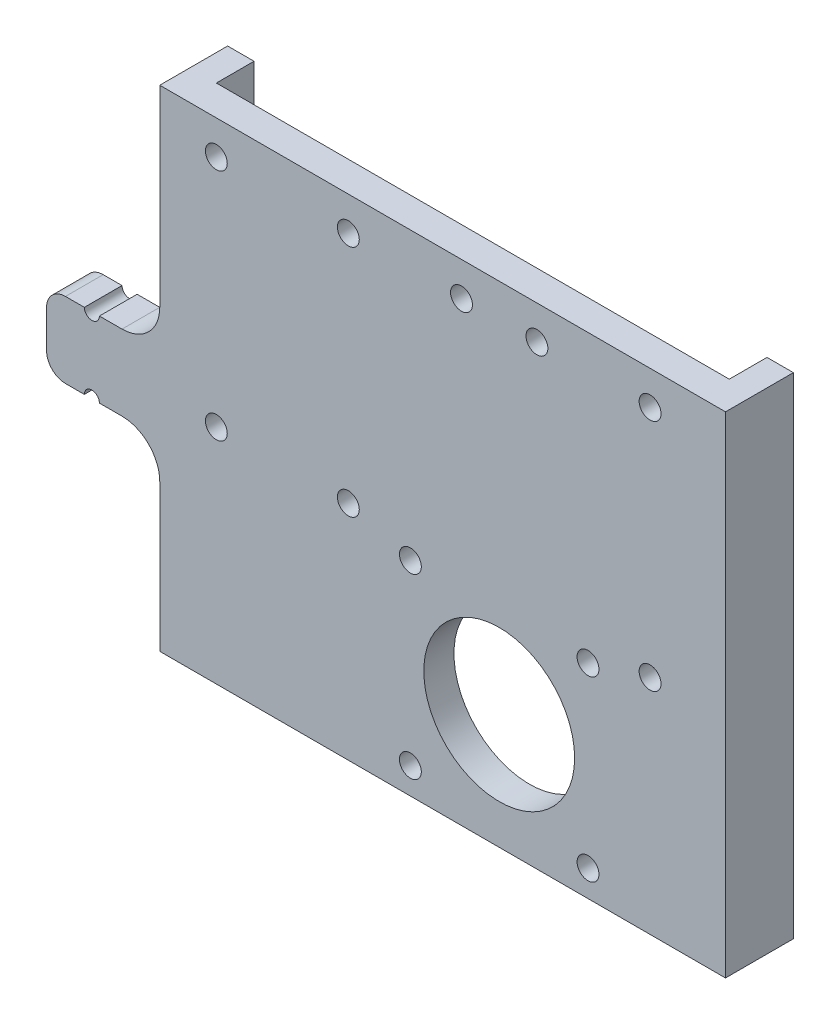
ISO-10303-21;
HEADER;
FILE_DESCRIPTION(('STEP AP214'),'2;1');
FILE_NAME('part.step','',(''),(''),'','','');
FILE_SCHEMA(('AUTOMOTIVE_DESIGN { 1 0 10303 214 1 1 1 1 }'));
ENDSEC;
DATA;
#1=APPLICATION_CONTEXT('core data for automotive mechanical design processes');
#2=APPLICATION_PROTOCOL_DEFINITION('international standard','automotive_design',2000,#1);
#3=PRODUCT_CONTEXT('',#1,'mechanical');
#4=PRODUCT('Part','Part','',(#3));
#5=PRODUCT_RELATED_PRODUCT_CATEGORY('part','',(#4));
#6=PRODUCT_DEFINITION_FORMATION('','',#4);
#7=PRODUCT_DEFINITION_CONTEXT('part definition',#1,'design');
#8=PRODUCT_DEFINITION('design','',#6,#7);
#9=PRODUCT_DEFINITION_SHAPE('','',#8);
#10=(LENGTH_UNIT() NAMED_UNIT(*) SI_UNIT(.MILLI.,.METRE.));
#11=(NAMED_UNIT(*) PLANE_ANGLE_UNIT() SI_UNIT($,.RADIAN.));
#12=(NAMED_UNIT(*) SI_UNIT($,.STERADIAN.) SOLID_ANGLE_UNIT());
#13=UNCERTAINTY_MEASURE_WITH_UNIT(LENGTH_MEASURE(1.E-05),#10,'distance_accuracy_value','');
#14=(GEOMETRIC_REPRESENTATION_CONTEXT(3) GLOBAL_UNCERTAINTY_ASSIGNED_CONTEXT((#13)) GLOBAL_UNIT_ASSIGNED_CONTEXT((#10,
#11,#12)) REPRESENTATION_CONTEXT('',''));
#15=CARTESIAN_POINT('',(0.,0.,0.));
#16=DIRECTION('',(0.,0.,1.));
#17=DIRECTION('',(1.,0.,0.));
#18=AXIS2_PLACEMENT_3D('',#15,#16,#17);
#19=CARTESIAN_POINT('',(-90.,4.00000000000002,-2.));
#20=DIRECTION('',(0.,1.,0.));
#21=DIRECTION('',(0.,0.,-1.));
#22=AXIS2_PLACEMENT_3D('',#19,#20,#21);
#23=PLANE('',#22);
#24=DIRECTION('',(0.,0.,-1.));
#25=VECTOR('',#24,1.);
#26=CARTESIAN_POINT('',(-110.,4.00000000000002,8.001));
#27=LINE('',#26,#25);
#28=CARTESIAN_POINT('',(-110.,4.00000000000002,8.));
#29=VERTEX_POINT('',#28);
#30=CARTESIAN_POINT('',(-110.,4.00000000000002,-2.));
#31=VERTEX_POINT('',#30);
#32=EDGE_CURVE('E216',#29,#31,#27,.T.);
#33=ORIENTED_EDGE('',*,*,#32,.T.);
#34=DIRECTION('',(1.,0.,0.));
#35=VECTOR('',#34,1.);
#36=CARTESIAN_POINT('',(-90.,4.00000000000002,-2.));
#37=LINE('',#36,#35);
#38=CARTESIAN_POINT('',(-115.,4.00000000000002,-2.));
#39=VERTEX_POINT('',#38);
#40=EDGE_CURVE('E230',#39,#31,#37,.T.);
#41=ORIENTED_EDGE('',*,*,#40,.F.);
#42=DIRECTION('',(0.,0.,1.));
#43=VECTOR('',#42,1.);
#44=CARTESIAN_POINT('',(-115.,4.00000000000002,-2.));
#45=LINE('',#44,#43);
#46=CARTESIAN_POINT('',(-115.,4.00000000000002,8.));
#47=VERTEX_POINT('',#46);
#48=EDGE_CURVE('E11',#47,#39,#45,.F.);
#49=ORIENTED_EDGE('',*,*,#48,.F.);
#50=DIRECTION('',(1.,0.,0.));
#51=VECTOR('',#50,1.);
#52=CARTESIAN_POINT('',(-90.,4.00000000000002,8.));
#53=LINE('',#52,#51);
#54=EDGE_CURVE('E223',#47,#29,#53,.T.);
#55=ORIENTED_EDGE('',*,*,#54,.T.);
#56=EDGE_LOOP('',(#33,#41,#49,#55));
#57=FACE_BOUND('',#56,.T.);
#58=ADVANCED_FACE('F44',(#57),#23,.T.);
#59=CARTESIAN_POINT('',(-90.,-16.,-2.));
#60=DIRECTION('',(0.,-1.,0.));
#61=DIRECTION('',(0.,0.,1.));
#62=AXIS2_PLACEMENT_3D('',#59,#60,#61);
#63=PLANE('',#62);
#64=DIRECTION('',(0.,0.,-1.));
#65=VECTOR('',#64,1.);
#66=CARTESIAN_POINT('',(-106.,-16.,8.001));
#67=LINE('',#66,#65);
#68=CARTESIAN_POINT('',(-106.,-16.,8.));
#69=VERTEX_POINT('',#68);
#70=CARTESIAN_POINT('',(-106.,-16.,-2.));
#71=VERTEX_POINT('',#70);
#72=EDGE_CURVE('E192',#69,#71,#67,.T.);
#73=ORIENTED_EDGE('',*,*,#72,.T.);
#74=DIRECTION('',(-1.,0.,0.));
#75=VECTOR('',#74,1.);
#76=CARTESIAN_POINT('',(-90.,-16.,-2.));
#77=LINE('',#76,#75);
#78=CARTESIAN_POINT('',(-100.,-16.,-2.));
#79=VERTEX_POINT('',#78);
#80=EDGE_CURVE('E224',#79,#71,#77,.T.);
#81=ORIENTED_EDGE('',*,*,#80,.F.);
#82=DIRECTION('',(0.,0.,1.));
#83=VECTOR('',#82,1.);
#84=CARTESIAN_POINT('',(-100.,-16.,-2.));
#85=LINE('',#84,#83);
#86=CARTESIAN_POINT('',(-100.,-16.,8.));
#87=VERTEX_POINT('',#86);
#88=EDGE_CURVE('E387',#87,#79,#85,.F.);
#89=ORIENTED_EDGE('',*,*,#88,.F.);
#90=DIRECTION('',(-1.,0.,0.));
#91=VECTOR('',#90,1.);
#92=CARTESIAN_POINT('',(-90.,-16.,8.));
#93=LINE('',#92,#91);
#94=EDGE_CURVE('E203',#87,#69,#93,.T.);
#95=ORIENTED_EDGE('',*,*,#94,.T.);
#96=EDGE_LOOP('',(#73,#81,#89,#95));
#97=FACE_BOUND('',#96,.T.);
#98=ADVANCED_FACE('F418',(#97),#63,.T.);
#99=CARTESIAN_POINT('',(0.,0.,0.));
#100=DIRECTION('',(0.,0.,1.));
#101=DIRECTION('',(1.,0.,0.));
#102=AXIS2_PLACEMENT_3D('',#99,#100,#101);
#103=PLANE('',#102);
#104=CARTESIAN_POINT('',(-75.,-5.99999999999998,0.));
#105=DIRECTION('',(0.,0.,-1.));
#106=DIRECTION('',(1.,0.,0.));
#107=AXIS2_PLACEMENT_3D('',#104,#105,#106);
#108=CIRCLE('',#107,2.9);
#109=CARTESIAN_POINT('',(-72.1,-5.99999999999998,0.));
#110=VERTEX_POINT('',#109);
#111=EDGE_CURVE('E275',#110,#110,#108,.T.);
#112=ORIENTED_EDGE('',*,*,#111,.F.);
#113=EDGE_LOOP('',(#112));
#114=FACE_BOUND('',#113,.T.);
#115=CARTESIAN_POINT('',(-75.,56.,0.));
#116=DIRECTION('',(0.,0.,-1.));
#117=DIRECTION('',(1.,0.,0.));
#118=AXIS2_PLACEMENT_3D('',#115,#116,#117);
#119=CIRCLE('',#118,2.9);
#120=CARTESIAN_POINT('',(-72.1,56.,0.));
#121=VERTEX_POINT('',#120);
#122=EDGE_CURVE('E281',#121,#121,#119,.T.);
#123=ORIENTED_EDGE('',*,*,#122,.F.);
#124=EDGE_LOOP('',(#123));
#125=FACE_BOUND('',#124,.T.);
#126=CARTESIAN_POINT('',(0.,-34.5,0.));
#127=DIRECTION('',(0.,0.,-1.));
#128=DIRECTION('',(1.,0.,0.));
#129=AXIS2_PLACEMENT_3D('',#126,#127,#128);
#130=CIRCLE('',#129,20.);
#131=CARTESIAN_POINT('',(20.,-34.5,0.));
#132=VERTEX_POINT('',#131);
#133=EDGE_CURVE('E305',#132,#132,#130,.T.);
#134=ORIENTED_EDGE('',*,*,#133,.F.);
#135=EDGE_LOOP('',(#134));
#136=FACE_BOUND('',#135,.T.);
#137=CARTESIAN_POINT('',(-40.,-5.99999999999998,0.));
#138=DIRECTION('',(0.,0.,-1.));
#139=DIRECTION('',(1.,0.,0.));
#140=AXIS2_PLACEMENT_3D('',#137,#138,#139);
#141=CIRCLE('',#140,2.9);
#142=CARTESIAN_POINT('',(-37.1,-5.99999999999998,0.));
#143=VERTEX_POINT('',#142);
#144=EDGE_CURVE('E309',#143,#143,#141,.T.);
#145=ORIENTED_EDGE('',*,*,#144,.F.);
#146=EDGE_LOOP('',(#145));
#147=FACE_BOUND('',#146,.T.);
#148=CARTESIAN_POINT('',(40.,-5.99999999999999,0.));
#149=DIRECTION('',(0.,0.,-1.));
#150=DIRECTION('',(1.,0.,0.));
#151=AXIS2_PLACEMENT_3D('',#148,#149,#150);
#152=CIRCLE('',#151,2.9);
#153=CARTESIAN_POINT('',(42.9,-5.99999999999999,0.));
#154=VERTEX_POINT('',#153);
#155=EDGE_CURVE('E315',#154,#154,#152,.T.);
#156=ORIENTED_EDGE('',*,*,#155,.F.);
#157=EDGE_LOOP('',(#156));
#158=FACE_BOUND('',#157,.T.);
#159=CARTESIAN_POINT('',(-40.,56.,0.));
#160=DIRECTION('',(0.,0.,-1.));
#161=DIRECTION('',(1.,0.,0.));
#162=AXIS2_PLACEMENT_3D('',#159,#160,#161);
#163=CIRCLE('',#162,2.9);
#164=CARTESIAN_POINT('',(-37.1,56.,0.));
#165=VERTEX_POINT('',#164);
#166=EDGE_CURVE('E321',#165,#165,#163,.T.);
#167=ORIENTED_EDGE('',*,*,#166,.F.);
#168=EDGE_LOOP('',(#167));
#169=FACE_BOUND('',#168,.T.);
#170=CARTESIAN_POINT('',(40.,56.,0.));
#171=DIRECTION('',(0.,0.,-1.));
#172=DIRECTION('',(1.,0.,0.));
#173=AXIS2_PLACEMENT_3D('',#170,#171,#172);
#174=CIRCLE('',#173,2.9);
#175=CARTESIAN_POINT('',(42.9,56.,0.));
#176=VERTEX_POINT('',#175);
#177=EDGE_CURVE('E327',#176,#176,#174,.T.);
#178=ORIENTED_EDGE('',*,*,#177,.F.);
#179=EDGE_LOOP('',(#178));
#180=FACE_BOUND('',#179,.T.);
#181=CARTESIAN_POINT('',(-23.55,-58.,0.));
#182=DIRECTION('',(0.,0.,-1.));
#183=DIRECTION('',(1.,0.,0.));
#184=AXIS2_PLACEMENT_3D('',#181,#182,#183);
#185=CIRCLE('',#184,2.9);
#186=CARTESIAN_POINT('',(-20.65,-58.,0.));
#187=VERTEX_POINT('',#186);
#188=EDGE_CURVE('E333',#187,#187,#185,.T.);
#189=ORIENTED_EDGE('',*,*,#188,.F.);
#190=EDGE_LOOP('',(#189));
#191=FACE_BOUND('',#190,.T.);
#192=CARTESIAN_POINT('',(23.55,-58.,0.));
#193=DIRECTION('',(0.,0.,-1.));
#194=DIRECTION('',(1.,0.,0.));
#195=AXIS2_PLACEMENT_3D('',#192,#193,#194);
#196=CIRCLE('',#195,2.9);
#197=CARTESIAN_POINT('',(26.45,-58.,0.));
#198=VERTEX_POINT('',#197);
#199=EDGE_CURVE('E339',#198,#198,#196,.T.);
#200=ORIENTED_EDGE('',*,*,#199,.F.);
#201=EDGE_LOOP('',(#200));
#202=FACE_BOUND('',#201,.T.);
#203=CARTESIAN_POINT('',(-23.55,-10.9,0.));
#204=DIRECTION('',(0.,0.,-1.));
#205=DIRECTION('',(1.,0.,0.));
#206=AXIS2_PLACEMENT_3D('',#203,#204,#205);
#207=CIRCLE('',#206,2.9);
#208=CARTESIAN_POINT('',(-20.65,-10.9,0.));
#209=VERTEX_POINT('',#208);
#210=EDGE_CURVE('E345',#209,#209,#207,.T.);
#211=ORIENTED_EDGE('',*,*,#210,.F.);
#212=EDGE_LOOP('',(#211));
#213=FACE_BOUND('',#212,.T.);
#214=CARTESIAN_POINT('',(23.55,-10.9,0.));
#215=DIRECTION('',(0.,0.,-1.));
#216=DIRECTION('',(1.,0.,0.));
#217=AXIS2_PLACEMENT_3D('',#214,#215,#216);
#218=CIRCLE('',#217,2.9);
#219=CARTESIAN_POINT('',(26.45,-10.9,0.));
#220=VERTEX_POINT('',#219);
#221=EDGE_CURVE('E351',#220,#220,#218,.T.);
#222=ORIENTED_EDGE('',*,*,#221,.F.);
#223=EDGE_LOOP('',(#222));
#224=FACE_BOUND('',#223,.T.);
#225=CARTESIAN_POINT('',(-9.99999999999999,56.,0.));
#226=DIRECTION('',(0.,0.,-1.));
#227=DIRECTION('',(1.,0.,0.));
#228=AXIS2_PLACEMENT_3D('',#225,#226,#227);
#229=CIRCLE('',#228,2.9);
#230=CARTESIAN_POINT('',(-7.1,56.,0.));
#231=VERTEX_POINT('',#230);
#232=EDGE_CURVE('E357',#231,#231,#229,.T.);
#233=ORIENTED_EDGE('',*,*,#232,.F.);
#234=EDGE_LOOP('',(#233));
#235=FACE_BOUND('',#234,.T.);
#236=CARTESIAN_POINT('',(10.,56.,0.));
#237=DIRECTION('',(0.,0.,-1.));
#238=DIRECTION('',(1.,0.,0.));
#239=AXIS2_PLACEMENT_3D('',#236,#237,#238);
#240=CIRCLE('',#239,2.9);
#241=CARTESIAN_POINT('',(12.9,56.,0.));
#242=VERTEX_POINT('',#241);
#243=EDGE_CURVE('E363',#242,#242,#240,.T.);
#244=ORIENTED_EDGE('',*,*,#243,.F.);
#245=EDGE_LOOP('',(#244));
#246=FACE_BOUND('',#245,.T.);
#247=DIRECTION('',(0.,-1.,0.));
#248=VECTOR('',#247,1.);
#249=CARTESIAN_POINT('',(53.,-65.,0.));
#250=LINE('',#249,#248);
#251=CARTESIAN_POINT('',(53.,65.,0.));
#252=VERTEX_POINT('',#251);
#253=CARTESIAN_POINT('',(53.,-65.,0.));
#254=VERTEX_POINT('',#253);
#255=EDGE_CURVE('E242',#252,#254,#250,.T.);
#256=ORIENTED_EDGE('',*,*,#255,.T.);
#257=DIRECTION('',(-1.,0.,0.));
#258=VECTOR('',#257,1.);
#259=CARTESIAN_POINT('',(-50.,-65.,0.));
#260=LINE('',#259,#258);
#261=CARTESIAN_POINT('',(-83.,-65.,0.));
#262=VERTEX_POINT('',#261);
#263=EDGE_CURVE('E366',#254,#262,#260,.T.);
#264=ORIENTED_EDGE('',*,*,#263,.T.);
#265=DIRECTION('',(0.,1.,0.));
#266=VECTOR('',#265,1.);
#267=CARTESIAN_POINT('',(-83.,-65.,0.));
#268=LINE('',#267,#266);
#269=CARTESIAN_POINT('',(-83.,65.,0.));
#270=VERTEX_POINT('',#269);
#271=EDGE_CURVE('E253',#262,#270,#268,.T.);
#272=ORIENTED_EDGE('',*,*,#271,.T.);
#273=DIRECTION('',(1.,0.,0.));
#274=VECTOR('',#273,1.);
#275=CARTESIAN_POINT('',(-50.,65.,0.));
#276=LINE('',#275,#274);
#277=EDGE_CURVE('E371',#270,#252,#276,.T.);
#278=ORIENTED_EDGE('',*,*,#277,.T.);
#279=EDGE_LOOP('',(#256,#264,#272,#278));
#280=FACE_BOUND('',#279,.T.);
#281=ADVANCED_FACE('F476',(#114,#125,#136,#147,#158,#169,#180,#191,#202,#213,#224,#235,#246,
#280),#103,.F.);
#282=CARTESIAN_POINT('',(-50.,-65.,8.));
#283=DIRECTION('',(0.,1.,0.));
#284=DIRECTION('',(0.,0.,-1.));
#285=AXIS2_PLACEMENT_3D('',#282,#283,#284);
#286=PLANE('',#285);
#287=DIRECTION('',(0.,0.,1.));
#288=VECTOR('',#287,1.);
#289=CARTESIAN_POINT('',(60.,-65.,-136.014705087354));
#290=LINE('',#289,#288);
#291=CARTESIAN_POINT('',(60.,-65.,-10.));
#292=VERTEX_POINT('',#291);
#293=CARTESIAN_POINT('',(60.,-65.,8.));
#294=VERTEX_POINT('',#293);
#295=EDGE_CURVE('E284',#292,#294,#290,.T.);
#296=ORIENTED_EDGE('',*,*,#295,.T.);
#297=DIRECTION('',(-1.,0.,0.));
#298=VECTOR('',#297,1.);
#299=CARTESIAN_POINT('',(-50.,-65.,8.));
#300=LINE('',#299,#298);
#301=CARTESIAN_POINT('',(-90.,-65.,8.));
#302=VERTEX_POINT('',#301);
#303=EDGE_CURVE('E367',#294,#302,#300,.T.);
#304=ORIENTED_EDGE('',*,*,#303,.T.);
#305=DIRECTION('',(0.,0.,1.));
#306=VECTOR('',#305,1.);
#307=CARTESIAN_POINT('',(-90.,-65.,-136.014705087354));
#308=LINE('',#307,#306);
#309=CARTESIAN_POINT('',(-90.,-65.,-10.));
#310=VERTEX_POINT('',#309);
#311=EDGE_CURVE('E288',#310,#302,#308,.T.);
#312=ORIENTED_EDGE('',*,*,#311,.F.);
#313=DIRECTION('',(1.,0.,0.));
#314=VECTOR('',#313,1.);
#315=CARTESIAN_POINT('',(-90.,-65.,-10.));
#316=LINE('',#315,#314);
#317=CARTESIAN_POINT('',(-83.,-65.,-10.));
#318=VERTEX_POINT('',#317);
#319=EDGE_CURVE('E269',#310,#318,#316,.T.);
#320=ORIENTED_EDGE('',*,*,#319,.T.);
#321=DIRECTION('',(0.,0.,1.));
#322=VECTOR('',#321,1.);
#323=CARTESIAN_POINT('',(-83.,-65.,-10.));
#324=LINE('',#323,#322);
#325=EDGE_CURVE('E231',#318,#262,#324,.T.);
#326=ORIENTED_EDGE('',*,*,#325,.T.);
#327=ORIENTED_EDGE('',*,*,#263,.F.);
#328=DIRECTION('',(0.,0.,1.));
#329=VECTOR('',#328,1.);
#330=CARTESIAN_POINT('',(53.,-65.,-10.));
#331=LINE('',#330,#329);
#332=CARTESIAN_POINT('',(53.,-65.,-10.));
#333=VERTEX_POINT('',#332);
#334=EDGE_CURVE('E250',#333,#254,#331,.T.);
#335=ORIENTED_EDGE('',*,*,#334,.F.);
#336=DIRECTION('',(1.,0.,0.));
#337=VECTOR('',#336,1.);
#338=CARTESIAN_POINT('',(60.,-65.,-10.));
#339=LINE('',#338,#337);
#340=EDGE_CURVE('E247',#333,#292,#339,.T.);
#341=ORIENTED_EDGE('',*,*,#340,.T.);
#342=EDGE_LOOP('',(#296,#304,#312,#320,#326,#327,#335,#341));
#343=FACE_BOUND('',#342,.T.);
#344=ADVANCED_FACE('F431',(#343),#286,.F.);
#345=CARTESIAN_POINT('',(-50.,65.,8.));
#346=DIRECTION('',(0.,-1.,0.));
#347=DIRECTION('',(0.,0.,1.));
#348=AXIS2_PLACEMENT_3D('',#345,#346,#347);
#349=PLANE('',#348);
#350=DIRECTION('',(0.,0.,1.));
#351=VECTOR('',#350,1.);
#352=CARTESIAN_POINT('',(-90.,65.,-136.014705087354));
#353=LINE('',#352,#351);
#354=CARTESIAN_POINT('',(-90.,65.,-10.));
#355=VERTEX_POINT('',#354);
#356=CARTESIAN_POINT('',(-90.,65.,8.));
#357=VERTEX_POINT('',#356);
#358=EDGE_CURVE('E290',#355,#357,#353,.T.);
#359=ORIENTED_EDGE('',*,*,#358,.T.);
#360=DIRECTION('',(1.,0.,0.));
#361=VECTOR('',#360,1.);
#362=CARTESIAN_POINT('',(-50.,65.,8.));
#363=LINE('',#362,#361);
#364=CARTESIAN_POINT('',(60.,65.,8.));
#365=VERTEX_POINT('',#364);
#366=EDGE_CURVE('E370',#357,#365,#363,.T.);
#367=ORIENTED_EDGE('',*,*,#366,.T.);
#368=DIRECTION('',(0.,0.,1.));
#369=VECTOR('',#368,1.);
#370=CARTESIAN_POINT('',(60.,65.,-136.014705087354));
#371=LINE('',#370,#369);
#372=CARTESIAN_POINT('',(60.,65.,-10.));
#373=VERTEX_POINT('',#372);
#374=EDGE_CURVE('E296',#373,#365,#371,.T.);
#375=ORIENTED_EDGE('',*,*,#374,.F.);
#376=DIRECTION('',(-1.,0.,0.));
#377=VECTOR('',#376,1.);
#378=CARTESIAN_POINT('',(60.,65.,-10.));
#379=LINE('',#378,#377);
#380=CARTESIAN_POINT('',(53.,65.,-10.));
#381=VERTEX_POINT('',#380);
#382=EDGE_CURVE('E241',#373,#381,#379,.T.);
#383=ORIENTED_EDGE('',*,*,#382,.T.);
#384=DIRECTION('',(0.,0.,1.));
#385=VECTOR('',#384,1.);
#386=CARTESIAN_POINT('',(53.,65.,-10.));
#387=LINE('',#386,#385);
#388=EDGE_CURVE('E255',#381,#252,#387,.T.);
#389=ORIENTED_EDGE('',*,*,#388,.T.);
#390=ORIENTED_EDGE('',*,*,#277,.F.);
#391=DIRECTION('',(0.,0.,1.));
#392=VECTOR('',#391,1.);
#393=CARTESIAN_POINT('',(-83.,65.,-10.));
#394=LINE('',#393,#392);
#395=CARTESIAN_POINT('',(-83.,65.,-10.));
#396=VERTEX_POINT('',#395);
#397=EDGE_CURVE('E259',#396,#270,#394,.T.);
#398=ORIENTED_EDGE('',*,*,#397,.F.);
#399=DIRECTION('',(-1.,0.,0.));
#400=VECTOR('',#399,1.);
#401=CARTESIAN_POINT('',(-90.,65.,-10.));
#402=LINE('',#401,#400);
#403=EDGE_CURVE('E261',#396,#355,#402,.T.);
#404=ORIENTED_EDGE('',*,*,#403,.T.);
#405=EDGE_LOOP('',(#359,#367,#375,#383,#389,#390,#398,#404));
#406=FACE_BOUND('',#405,.T.);
#407=ADVANCED_FACE('F440',(#406),#349,.F.);
#408=CARTESIAN_POINT('',(0.,0.,8.));
#409=DIRECTION('',(0.,0.,1.));
#410=DIRECTION('',(1.,0.,0.));
#411=AXIS2_PLACEMENT_3D('',#408,#409,#410);
#412=PLANE('',#411);
#413=CARTESIAN_POINT('',(-108.,-16.,8.));
#414=DIRECTION('',(0.,0.,-1.));
#415=DIRECTION('',(1.,0.,0.));
#416=AXIS2_PLACEMENT_3D('',#413,#414,#415);
#417=CIRCLE('',#416,2.);
#418=CARTESIAN_POINT('',(-110.,-16.,8.));
#419=VERTEX_POINT('',#418);
#420=EDGE_CURVE('E198',#69,#419,#417,.F.);
#421=ORIENTED_EDGE('',*,*,#420,.F.);
#422=ORIENTED_EDGE('',*,*,#94,.F.);
#423=CARTESIAN_POINT('',(-100.,-26.,8.00000000000001));
#424=DIRECTION('',(0.,0.,-1.));
#425=DIRECTION('',(1.,0.,0.));
#426=AXIS2_PLACEMENT_3D('',#423,#424,#425);
#427=CIRCLE('',#426,10.);
#428=CARTESIAN_POINT('',(-90.,-26.,8.));
#429=VERTEX_POINT('',#428);
#430=EDGE_CURVE('E395',#429,#87,#427,.F.);
#431=ORIENTED_EDGE('',*,*,#430,.F.);
#432=DIRECTION('',(0.,1.,0.));
#433=VECTOR('',#432,1.);
#434=CARTESIAN_POINT('',(-90.,-65.,8.));
#435=LINE('',#434,#433);
#436=EDGE_CURVE('E285',#302,#429,#435,.T.);
#437=ORIENTED_EDGE('',*,*,#436,.F.);
#438=ORIENTED_EDGE('',*,*,#303,.F.);
#439=DIRECTION('',(0.,-1.,0.));
#440=VECTOR('',#439,1.);
#441=CARTESIAN_POINT('',(60.,-65.,8.));
#442=LINE('',#441,#440);
#443=EDGE_CURVE('E299',#365,#294,#442,.T.);
#444=ORIENTED_EDGE('',*,*,#443,.F.);
#445=ORIENTED_EDGE('',*,*,#366,.F.);
#446=CARTESIAN_POINT('',(-90.,14.,8.));
#447=VERTEX_POINT('',#446);
#448=EDGE_CURVE('E289',#447,#357,#435,.T.);
#449=ORIENTED_EDGE('',*,*,#448,.F.);
#450=CARTESIAN_POINT('',(-100.,14.,8.));
#451=DIRECTION('',(0.,0.,-1.));
#452=DIRECTION('',(1.,0.,0.));
#453=AXIS2_PLACEMENT_3D('',#450,#451,#452);
#454=CIRCLE('',#453,10.);
#455=CARTESIAN_POINT('',(-100.,4.00000000000002,8.));
#456=VERTEX_POINT('',#455);
#457=EDGE_CURVE('E390',#456,#447,#454,.F.);
#458=ORIENTED_EDGE('',*,*,#457,.F.);
#459=CARTESIAN_POINT('',(-106.,4.00000000000002,8.));
#460=VERTEX_POINT('',#459);
#461=EDGE_CURVE('E236',#460,#456,#53,.T.);
#462=ORIENTED_EDGE('',*,*,#461,.F.);
#463=CARTESIAN_POINT('',(-108.,4.00000000000002,8.));
#464=DIRECTION('',(0.,0.,-1.));
#465=DIRECTION('',(1.,0.,0.));
#466=AXIS2_PLACEMENT_3D('',#463,#464,#465);
#467=CIRCLE('',#466,2.);
#468=EDGE_CURVE('E207',#29,#460,#467,.F.);
#469=ORIENTED_EDGE('',*,*,#468,.F.);
#470=ORIENTED_EDGE('',*,*,#54,.F.);
#471=CARTESIAN_POINT('',(-115.,-0.999999999999984,8.));
#472=DIRECTION('',(0.,0.,-1.));
#473=DIRECTION('',(1.,0.,0.));
#474=AXIS2_PLACEMENT_3D('',#471,#472,#473);
#475=CIRCLE('',#474,5.);
#476=CARTESIAN_POINT('',(-120.,-0.999999999999984,8.));
#477=VERTEX_POINT('',#476);
#478=EDGE_CURVE('E401',#477,#47,#475,.T.);
#479=ORIENTED_EDGE('',*,*,#478,.F.);
#480=DIRECTION('',(0.,1.,0.));
#481=VECTOR('',#480,1.);
#482=CARTESIAN_POINT('',(-120.,-16.,8.));
#483=LINE('',#482,#481);
#484=CARTESIAN_POINT('',(-120.,-11.,8.));
#485=VERTEX_POINT('',#484);
#486=EDGE_CURVE('E233',#485,#477,#483,.T.);
#487=ORIENTED_EDGE('',*,*,#486,.F.);
#488=CARTESIAN_POINT('',(-115.,-11.,8.));
#489=DIRECTION('',(0.,0.,-1.));
#490=DIRECTION('',(1.,0.,0.));
#491=AXIS2_PLACEMENT_3D('',#488,#489,#490);
#492=CIRCLE('',#491,5.);
#493=CARTESIAN_POINT('',(-115.,-16.,8.));
#494=VERTEX_POINT('',#493);
#495=EDGE_CURVE('E202',#494,#485,#492,.T.);
#496=ORIENTED_EDGE('',*,*,#495,.F.);
#497=EDGE_CURVE('E187',#419,#494,#93,.T.);
#498=ORIENTED_EDGE('',*,*,#497,.F.);
#499=EDGE_LOOP('',(#421,#422,#431,#437,#438,#444,#445,#449,#458,#462,#469,#470,#479,#487,#496,#498));
#500=FACE_BOUND('',#499,.T.);
#501=CARTESIAN_POINT('',(-75.,-5.99999999999998,8.));
#502=DIRECTION('',(0.,0.,-1.));
#503=DIRECTION('',(1.,0.,0.));
#504=AXIS2_PLACEMENT_3D('',#501,#502,#503);
#505=CIRCLE('',#504,2.9);
#506=CARTESIAN_POINT('',(-72.1,-5.99999999999998,8.));
#507=VERTEX_POINT('',#506);
#508=EDGE_CURVE('E257',#507,#507,#505,.T.);
#509=ORIENTED_EDGE('',*,*,#508,.T.);
#510=EDGE_LOOP('',(#509));
#511=FACE_BOUND('',#510,.T.);
#512=CARTESIAN_POINT('',(-75.,56.,8.));
#513=DIRECTION('',(0.,0.,-1.));
#514=DIRECTION('',(1.,0.,0.));
#515=AXIS2_PLACEMENT_3D('',#512,#513,#514);
#516=CIRCLE('',#515,2.9);
#517=CARTESIAN_POINT('',(-72.1,56.,8.));
#518=VERTEX_POINT('',#517);
#519=EDGE_CURVE('E278',#518,#518,#516,.T.);
#520=ORIENTED_EDGE('',*,*,#519,.T.);
#521=EDGE_LOOP('',(#520));
#522=FACE_BOUND('',#521,.T.);
#523=CARTESIAN_POINT('',(0.,-34.5,8.));
#524=DIRECTION('',(0.,0.,-1.));
#525=DIRECTION('',(1.,0.,0.));
#526=AXIS2_PLACEMENT_3D('',#523,#524,#525);
#527=CIRCLE('',#526,20.);
#528=CARTESIAN_POINT('',(20.,-34.5,8.));
#529=VERTEX_POINT('',#528);
#530=EDGE_CURVE('E293',#529,#529,#527,.T.);
#531=ORIENTED_EDGE('',*,*,#530,.T.);
#532=EDGE_LOOP('',(#531));
#533=FACE_BOUND('',#532,.T.);
#534=CARTESIAN_POINT('',(-40.,-5.99999999999998,8.));
#535=DIRECTION('',(0.,0.,-1.));
#536=DIRECTION('',(1.,0.,0.));
#537=AXIS2_PLACEMENT_3D('',#534,#535,#536);
#538=CIRCLE('',#537,2.9);
#539=CARTESIAN_POINT('',(-37.1,-5.99999999999998,8.));
#540=VERTEX_POINT('',#539);
#541=EDGE_CURVE('E306',#540,#540,#538,.T.);
#542=ORIENTED_EDGE('',*,*,#541,.T.);
#543=EDGE_LOOP('',(#542));
#544=FACE_BOUND('',#543,.T.);
#545=CARTESIAN_POINT('',(40.,-5.99999999999999,8.));
#546=DIRECTION('',(0.,0.,-1.));
#547=DIRECTION('',(1.,0.,0.));
#548=AXIS2_PLACEMENT_3D('',#545,#546,#547);
#549=CIRCLE('',#548,2.9);
#550=CARTESIAN_POINT('',(42.9,-5.99999999999999,8.));
#551=VERTEX_POINT('',#550);
#552=EDGE_CURVE('E312',#551,#551,#549,.T.);
#553=ORIENTED_EDGE('',*,*,#552,.T.);
#554=EDGE_LOOP('',(#553));
#555=FACE_BOUND('',#554,.T.);
#556=CARTESIAN_POINT('',(-40.,56.,8.));
#557=DIRECTION('',(0.,0.,-1.));
#558=DIRECTION('',(1.,0.,0.));
#559=AXIS2_PLACEMENT_3D('',#556,#557,#558);
#560=CIRCLE('',#559,2.9);
#561=CARTESIAN_POINT('',(-37.1,56.,8.));
#562=VERTEX_POINT('',#561);
#563=EDGE_CURVE('E318',#562,#562,#560,.T.);
#564=ORIENTED_EDGE('',*,*,#563,.T.);
#565=EDGE_LOOP('',(#564));
#566=FACE_BOUND('',#565,.T.);
#567=CARTESIAN_POINT('',(40.,56.,8.));
#568=DIRECTION('',(0.,0.,-1.));
#569=DIRECTION('',(1.,0.,0.));
#570=AXIS2_PLACEMENT_3D('',#567,#568,#569);
#571=CIRCLE('',#570,2.9);
#572=CARTESIAN_POINT('',(42.9,56.,8.));
#573=VERTEX_POINT('',#572);
#574=EDGE_CURVE('E324',#573,#573,#571,.T.);
#575=ORIENTED_EDGE('',*,*,#574,.T.);
#576=EDGE_LOOP('',(#575));
#577=FACE_BOUND('',#576,.T.);
#578=CARTESIAN_POINT('',(-23.55,-58.,8.));
#579=DIRECTION('',(0.,0.,-1.));
#580=DIRECTION('',(1.,0.,0.));
#581=AXIS2_PLACEMENT_3D('',#578,#579,#580);
#582=CIRCLE('',#581,2.9);
#583=CARTESIAN_POINT('',(-20.65,-58.,8.));
#584=VERTEX_POINT('',#583);
#585=EDGE_CURVE('E330',#584,#584,#582,.T.);
#586=ORIENTED_EDGE('',*,*,#585,.T.);
#587=EDGE_LOOP('',(#586));
#588=FACE_BOUND('',#587,.T.);
#589=CARTESIAN_POINT('',(23.55,-58.,8.));
#590=DIRECTION('',(0.,0.,-1.));
#591=DIRECTION('',(1.,0.,0.));
#592=AXIS2_PLACEMENT_3D('',#589,#590,#591);
#593=CIRCLE('',#592,2.9);
#594=CARTESIAN_POINT('',(26.45,-58.,8.));
#595=VERTEX_POINT('',#594);
#596=EDGE_CURVE('E336',#595,#595,#593,.T.);
#597=ORIENTED_EDGE('',*,*,#596,.T.);
#598=EDGE_LOOP('',(#597));
#599=FACE_BOUND('',#598,.T.);
#600=CARTESIAN_POINT('',(-23.55,-10.9,8.));
#601=DIRECTION('',(0.,0.,-1.));
#602=DIRECTION('',(1.,0.,0.));
#603=AXIS2_PLACEMENT_3D('',#600,#601,#602);
#604=CIRCLE('',#603,2.9);
#605=CARTESIAN_POINT('',(-20.65,-10.9,8.));
#606=VERTEX_POINT('',#605);
#607=EDGE_CURVE('E342',#606,#606,#604,.T.);
#608=ORIENTED_EDGE('',*,*,#607,.T.);
#609=EDGE_LOOP('',(#608));
#610=FACE_BOUND('',#609,.T.);
#611=CARTESIAN_POINT('',(23.55,-10.9,8.));
#612=DIRECTION('',(0.,0.,-1.));
#613=DIRECTION('',(1.,0.,0.));
#614=AXIS2_PLACEMENT_3D('',#611,#612,#613);
#615=CIRCLE('',#614,2.9);
#616=CARTESIAN_POINT('',(26.45,-10.9,8.));
#617=VERTEX_POINT('',#616);
#618=EDGE_CURVE('E348',#617,#617,#615,.T.);
#619=ORIENTED_EDGE('',*,*,#618,.T.);
#620=EDGE_LOOP('',(#619));
#621=FACE_BOUND('',#620,.T.);
#622=CARTESIAN_POINT('',(-9.99999999999999,56.,8.));
#623=DIRECTION('',(0.,0.,-1.));
#624=DIRECTION('',(1.,0.,0.));
#625=AXIS2_PLACEMENT_3D('',#622,#623,#624);
#626=CIRCLE('',#625,2.9);
#627=CARTESIAN_POINT('',(-7.09999999999999,56.,8.));
#628=VERTEX_POINT('',#627);
#629=EDGE_CURVE('E354',#628,#628,#626,.T.);
#630=ORIENTED_EDGE('',*,*,#629,.T.);
#631=EDGE_LOOP('',(#630));
#632=FACE_BOUND('',#631,.T.);
#633=CARTESIAN_POINT('',(10.,56.,8.));
#634=DIRECTION('',(0.,0.,-1.));
#635=DIRECTION('',(1.,0.,0.));
#636=AXIS2_PLACEMENT_3D('',#633,#634,#635);
#637=CIRCLE('',#636,2.9);
#638=CARTESIAN_POINT('',(12.9,56.,8.));
#639=VERTEX_POINT('',#638);
#640=EDGE_CURVE('E360',#639,#639,#637,.T.);
#641=ORIENTED_EDGE('',*,*,#640,.T.);
#642=EDGE_LOOP('',(#641));
#643=FACE_BOUND('',#642,.T.);
#644=ADVANCED_FACE('F195',(#500,#511,#522,#533,#544,#555,#566,#577,#588,#599,#610,#621,#632,
#643),#412,.T.);
#645=CARTESIAN_POINT('',(10.,56.,8.));
#646=DIRECTION('',(0.,0.,1.));
#647=DIRECTION('',(1.,0.,0.));
#648=AXIS2_PLACEMENT_3D('',#645,#646,#647);
#649=CYLINDRICAL_SURFACE('',#648,2.9);
#650=ORIENTED_EDGE('',*,*,#243,.T.);
#651=EDGE_LOOP('',(#650));
#652=FACE_BOUND('',#651,.T.);
#653=ORIENTED_EDGE('',*,*,#640,.F.);
#654=EDGE_LOOP('',(#653));
#655=FACE_BOUND('',#654,.T.);
#656=ADVANCED_FACE('F704',(#652,#655),#649,.F.);
#657=CARTESIAN_POINT('',(-9.99999999999999,56.,8.));
#658=DIRECTION('',(0.,0.,1.));
#659=DIRECTION('',(1.,0.,0.));
#660=AXIS2_PLACEMENT_3D('',#657,#658,#659);
#661=CYLINDRICAL_SURFACE('',#660,2.9);
#662=ORIENTED_EDGE('',*,*,#232,.T.);
#663=EDGE_LOOP('',(#662));
#664=FACE_BOUND('',#663,.T.);
#665=ORIENTED_EDGE('',*,*,#629,.F.);
#666=EDGE_LOOP('',(#665));
#667=FACE_BOUND('',#666,.T.);
#668=ADVANCED_FACE('F694',(#664,#667),#661,.F.);
#669=CARTESIAN_POINT('',(23.55,-10.9,8.));
#670=DIRECTION('',(0.,0.,1.));
#671=DIRECTION('',(1.,0.,0.));
#672=AXIS2_PLACEMENT_3D('',#669,#670,#671);
#673=CYLINDRICAL_SURFACE('',#672,2.9);
#674=ORIENTED_EDGE('',*,*,#221,.T.);
#675=EDGE_LOOP('',(#674));
#676=FACE_BOUND('',#675,.T.);
#677=ORIENTED_EDGE('',*,*,#618,.F.);
#678=EDGE_LOOP('',(#677));
#679=FACE_BOUND('',#678,.T.);
#680=ADVANCED_FACE('F684',(#676,#679),#673,.F.);
#681=CARTESIAN_POINT('',(-23.55,-10.9,8.));
#682=DIRECTION('',(0.,0.,1.));
#683=DIRECTION('',(1.,0.,0.));
#684=AXIS2_PLACEMENT_3D('',#681,#682,#683);
#685=CYLINDRICAL_SURFACE('',#684,2.9);
#686=ORIENTED_EDGE('',*,*,#210,.T.);
#687=EDGE_LOOP('',(#686));
#688=FACE_BOUND('',#687,.T.);
#689=ORIENTED_EDGE('',*,*,#607,.F.);
#690=EDGE_LOOP('',(#689));
#691=FACE_BOUND('',#690,.T.);
#692=ADVANCED_FACE('F674',(#688,#691),#685,.F.);
#693=CARTESIAN_POINT('',(23.55,-58.,8.));
#694=DIRECTION('',(0.,0.,1.));
#695=DIRECTION('',(1.,0.,0.));
#696=AXIS2_PLACEMENT_3D('',#693,#694,#695);
#697=CYLINDRICAL_SURFACE('',#696,2.9);
#698=ORIENTED_EDGE('',*,*,#199,.T.);
#699=EDGE_LOOP('',(#698));
#700=FACE_BOUND('',#699,.T.);
#701=ORIENTED_EDGE('',*,*,#596,.F.);
#702=EDGE_LOOP('',(#701));
#703=FACE_BOUND('',#702,.T.);
#704=ADVANCED_FACE('F664',(#700,#703),#697,.F.);
#705=CARTESIAN_POINT('',(-23.55,-58.,8.));
#706=DIRECTION('',(0.,0.,1.));
#707=DIRECTION('',(1.,0.,0.));
#708=AXIS2_PLACEMENT_3D('',#705,#706,#707);
#709=CYLINDRICAL_SURFACE('',#708,2.9);
#710=ORIENTED_EDGE('',*,*,#188,.T.);
#711=EDGE_LOOP('',(#710));
#712=FACE_BOUND('',#711,.T.);
#713=ORIENTED_EDGE('',*,*,#585,.F.);
#714=EDGE_LOOP('',(#713));
#715=FACE_BOUND('',#714,.T.);
#716=ADVANCED_FACE('F654',(#712,#715),#709,.F.);
#717=CARTESIAN_POINT('',(40.,56.,8.));
#718=DIRECTION('',(0.,0.,1.));
#719=DIRECTION('',(1.,0.,0.));
#720=AXIS2_PLACEMENT_3D('',#717,#718,#719);
#721=CYLINDRICAL_SURFACE('',#720,2.9);
#722=ORIENTED_EDGE('',*,*,#177,.T.);
#723=EDGE_LOOP('',(#722));
#724=FACE_BOUND('',#723,.T.);
#725=ORIENTED_EDGE('',*,*,#574,.F.);
#726=EDGE_LOOP('',(#725));
#727=FACE_BOUND('',#726,.T.);
#728=ADVANCED_FACE('F644',(#724,#727),#721,.F.);
#729=CARTESIAN_POINT('',(-40.,56.,8.));
#730=DIRECTION('',(0.,0.,1.));
#731=DIRECTION('',(1.,0.,0.));
#732=AXIS2_PLACEMENT_3D('',#729,#730,#731);
#733=CYLINDRICAL_SURFACE('',#732,2.9);
#734=ORIENTED_EDGE('',*,*,#166,.T.);
#735=EDGE_LOOP('',(#734));
#736=FACE_BOUND('',#735,.T.);
#737=ORIENTED_EDGE('',*,*,#563,.F.);
#738=EDGE_LOOP('',(#737));
#739=FACE_BOUND('',#738,.T.);
#740=ADVANCED_FACE('F634',(#736,#739),#733,.F.);
#741=CARTESIAN_POINT('',(40.,-5.99999999999999,8.));
#742=DIRECTION('',(0.,0.,1.));
#743=DIRECTION('',(1.,0.,0.));
#744=AXIS2_PLACEMENT_3D('',#741,#742,#743);
#745=CYLINDRICAL_SURFACE('',#744,2.9);
#746=ORIENTED_EDGE('',*,*,#155,.T.);
#747=EDGE_LOOP('',(#746));
#748=FACE_BOUND('',#747,.T.);
#749=ORIENTED_EDGE('',*,*,#552,.F.);
#750=EDGE_LOOP('',(#749));
#751=FACE_BOUND('',#750,.T.);
#752=ADVANCED_FACE('F624',(#748,#751),#745,.F.);
#753=CARTESIAN_POINT('',(-40.,-5.99999999999998,8.));
#754=DIRECTION('',(0.,0.,1.));
#755=DIRECTION('',(1.,0.,0.));
#756=AXIS2_PLACEMENT_3D('',#753,#754,#755);
#757=CYLINDRICAL_SURFACE('',#756,2.9);
#758=ORIENTED_EDGE('',*,*,#144,.T.);
#759=EDGE_LOOP('',(#758));
#760=FACE_BOUND('',#759,.T.);
#761=ORIENTED_EDGE('',*,*,#541,.F.);
#762=EDGE_LOOP('',(#761));
#763=FACE_BOUND('',#762,.T.);
#764=ADVANCED_FACE('F614',(#760,#763),#757,.F.);
#765=CARTESIAN_POINT('',(0.,-34.5,-2.));
#766=DIRECTION('',(0.,0.,1.));
#767=DIRECTION('',(1.,0.,0.));
#768=AXIS2_PLACEMENT_3D('',#765,#766,#767);
#769=CYLINDRICAL_SURFACE('',#768,20.);
#770=ORIENTED_EDGE('',*,*,#530,.F.);
#771=EDGE_LOOP('',(#770));
#772=FACE_BOUND('',#771,.T.);
#773=ORIENTED_EDGE('',*,*,#133,.T.);
#774=EDGE_LOOP('',(#773));
#775=FACE_BOUND('',#774,.T.);
#776=ADVANCED_FACE('F605',(#772,#775),#769,.F.);
#777=CARTESIAN_POINT('',(-90.,-65.,-136.014705087354));
#778=DIRECTION('',(-1.,0.,0.));
#779=DIRECTION('',(0.,1.,0.));
#780=AXIS2_PLACEMENT_3D('',#777,#778,#779);
#781=PLANE('',#780);
#782=ORIENTED_EDGE('',*,*,#448,.T.);
#783=ORIENTED_EDGE('',*,*,#358,.F.);
#784=DIRECTION('',(0.,-1.,0.));
#785=VECTOR('',#784,1.);
#786=CARTESIAN_POINT('',(-90.,-65.,-10.));
#787=LINE('',#786,#785);
#788=EDGE_CURVE('E264',#355,#310,#787,.T.);
#789=ORIENTED_EDGE('',*,*,#788,.T.);
#790=ORIENTED_EDGE('',*,*,#311,.T.);
#791=ORIENTED_EDGE('',*,*,#436,.T.);
#792=DIRECTION('',(0.,0.,1.));
#793=VECTOR('',#792,1.);
#794=CARTESIAN_POINT('',(-90.,-26.,8.00000000000001));
#795=LINE('',#794,#793);
#796=CARTESIAN_POINT('',(-90.,-26.,-2.));
#797=VERTEX_POINT('',#796);
#798=EDGE_CURVE('E382',#797,#429,#795,.T.);
#799=ORIENTED_EDGE('',*,*,#798,.F.);
#800=DIRECTION('',(0.,-1.,0.));
#801=VECTOR('',#800,1.);
#802=CARTESIAN_POINT('',(-90.,-16.,-2.));
#803=LINE('',#802,#801);
#804=CARTESIAN_POINT('',(-90.,14.,-2.));
#805=VERTEX_POINT('',#804);
#806=EDGE_CURVE('E220',#805,#797,#803,.T.);
#807=ORIENTED_EDGE('',*,*,#806,.F.);
#808=DIRECTION('',(0.,0.,1.));
#809=VECTOR('',#808,1.);
#810=CARTESIAN_POINT('',(-90.,14.,-2.));
#811=LINE('',#810,#809);
#812=EDGE_CURVE('E384',#447,#805,#811,.F.);
#813=ORIENTED_EDGE('',*,*,#812,.F.);
#814=EDGE_LOOP('',(#782,#783,#789,#790,#791,#799,#807,#813));
#815=FACE_BOUND('',#814,.T.);
#816=ADVANCED_FACE('F426',(#815),#781,.T.);
#817=CARTESIAN_POINT('',(60.,-65.,-136.014705087354));
#818=DIRECTION('',(1.,0.,0.));
#819=DIRECTION('',(0.,-1.,0.));
#820=AXIS2_PLACEMENT_3D('',#817,#818,#819);
#821=PLANE('',#820);
#822=ORIENTED_EDGE('',*,*,#374,.T.);
#823=ORIENTED_EDGE('',*,*,#443,.T.);
#824=ORIENTED_EDGE('',*,*,#295,.F.);
#825=DIRECTION('',(0.,1.,0.));
#826=VECTOR('',#825,1.);
#827=CARTESIAN_POINT('',(60.,-65.,-10.));
#828=LINE('',#827,#826);
#829=EDGE_CURVE('E239',#292,#373,#828,.T.);
#830=ORIENTED_EDGE('',*,*,#829,.T.);
#831=EDGE_LOOP('',(#822,#823,#824,#830));
#832=FACE_BOUND('',#831,.T.);
#833=ADVANCED_FACE('F437',(#832),#821,.T.);
#834=CARTESIAN_POINT('',(-75.,56.,8.));
#835=DIRECTION('',(0.,0.,1.));
#836=DIRECTION('',(1.,0.,0.));
#837=AXIS2_PLACEMENT_3D('',#834,#835,#836);
#838=CYLINDRICAL_SURFACE('',#837,2.9);
#839=ORIENTED_EDGE('',*,*,#122,.T.);
#840=EDGE_LOOP('',(#839));
#841=FACE_BOUND('',#840,.T.);
#842=ORIENTED_EDGE('',*,*,#519,.F.);
#843=EDGE_LOOP('',(#842));
#844=FACE_BOUND('',#843,.T.);
#845=ADVANCED_FACE('F578',(#841,#844),#838,.F.);
#846=CARTESIAN_POINT('',(-75.,-5.99999999999998,8.));
#847=DIRECTION('',(0.,0.,1.));
#848=DIRECTION('',(1.,0.,0.));
#849=AXIS2_PLACEMENT_3D('',#846,#847,#848);
#850=CYLINDRICAL_SURFACE('',#849,2.9);
#851=ORIENTED_EDGE('',*,*,#111,.T.);
#852=EDGE_LOOP('',(#851));
#853=FACE_BOUND('',#852,.T.);
#854=ORIENTED_EDGE('',*,*,#508,.F.);
#855=EDGE_LOOP('',(#854));
#856=FACE_BOUND('',#855,.T.);
#857=ADVANCED_FACE('F568',(#853,#856),#850,.F.);
#858=CARTESIAN_POINT('',(-83.,-65.,-10.));
#859=DIRECTION('',(-1.,0.,0.));
#860=DIRECTION('',(0.,0.,1.));
#861=AXIS2_PLACEMENT_3D('',#858,#859,#860);
#862=PLANE('',#861);
#863=ORIENTED_EDGE('',*,*,#271,.F.);
#864=ORIENTED_EDGE('',*,*,#325,.F.);
#865=DIRECTION('',(0.,1.,0.));
#866=VECTOR('',#865,1.);
#867=CARTESIAN_POINT('',(-83.,-65.,-10.));
#868=LINE('',#867,#866);
#869=EDGE_CURVE('E267',#318,#396,#868,.T.);
#870=ORIENTED_EDGE('',*,*,#869,.T.);
#871=ORIENTED_EDGE('',*,*,#397,.T.);
#872=EDGE_LOOP('',(#863,#864,#870,#871));
#873=FACE_BOUND('',#872,.T.);
#874=ADVANCED_FACE('F558',(#873),#862,.F.);
#875=CARTESIAN_POINT('',(0.,0.,-10.));
#876=DIRECTION('',(0.,0.,1.));
#877=DIRECTION('',(1.,0.,0.));
#878=AXIS2_PLACEMENT_3D('',#875,#876,#877);
#879=PLANE('',#878);
#880=ORIENTED_EDGE('',*,*,#788,.F.);
#881=ORIENTED_EDGE('',*,*,#403,.F.);
#882=ORIENTED_EDGE('',*,*,#869,.F.);
#883=ORIENTED_EDGE('',*,*,#319,.F.);
#884=EDGE_LOOP('',(#880,#881,#882,#883));
#885=FACE_BOUND('',#884,.T.);
#886=ADVANCED_FACE('F548',(#885),#879,.F.);
#887=CARTESIAN_POINT('',(53.,-65.,-10.));
#888=DIRECTION('',(1.,0.,0.));
#889=DIRECTION('',(0.,-1.,0.));
#890=AXIS2_PLACEMENT_3D('',#887,#888,#889);
#891=PLANE('',#890);
#892=ORIENTED_EDGE('',*,*,#255,.F.);
#893=ORIENTED_EDGE('',*,*,#388,.F.);
#894=DIRECTION('',(0.,-1.,0.));
#895=VECTOR('',#894,1.);
#896=CARTESIAN_POINT('',(53.,-65.,-10.));
#897=LINE('',#896,#895);
#898=EDGE_CURVE('E245',#381,#333,#897,.T.);
#899=ORIENTED_EDGE('',*,*,#898,.T.);
#900=ORIENTED_EDGE('',*,*,#334,.T.);
#901=EDGE_LOOP('',(#892,#893,#899,#900));
#902=FACE_BOUND('',#901,.T.);
#903=ADVANCED_FACE('F538',(#902),#891,.F.);
#904=CARTESIAN_POINT('',(0.,0.,-10.));
#905=DIRECTION('',(0.,0.,-1.));
#906=DIRECTION('',(-1.,0.,0.));
#907=AXIS2_PLACEMENT_3D('',#904,#905,#906);
#908=PLANE('',#907);
#909=ORIENTED_EDGE('',*,*,#829,.F.);
#910=ORIENTED_EDGE('',*,*,#340,.F.);
#911=ORIENTED_EDGE('',*,*,#898,.F.);
#912=ORIENTED_EDGE('',*,*,#382,.F.);
#913=EDGE_LOOP('',(#909,#910,#911,#912));
#914=FACE_BOUND('',#913,.T.);
#915=ADVANCED_FACE('F470',(#914),#908,.T.);
#916=DIRECTION('',(0.,0.,-1.));
#917=VECTOR('',#916,1.);
#918=CARTESIAN_POINT('',(-106.,4.00000000000002,8.001));
#919=LINE('',#918,#917);
#920=CARTESIAN_POINT('',(-106.,4.00000000000002,-2.));
#921=VERTEX_POINT('',#920);
#922=EDGE_CURVE('E214',#460,#921,#919,.T.);
#923=ORIENTED_EDGE('',*,*,#922,.F.);
#924=ORIENTED_EDGE('',*,*,#461,.T.);
#925=DIRECTION('',(0.,0.,1.));
#926=VECTOR('',#925,1.);
#927=CARTESIAN_POINT('',(-100.,4.00000000000002,8.));
#928=LINE('',#927,#926);
#929=CARTESIAN_POINT('',(-100.,4.00000000000002,-2.));
#930=VERTEX_POINT('',#929);
#931=EDGE_CURVE('E374',#930,#456,#928,.T.);
#932=ORIENTED_EDGE('',*,*,#931,.F.);
#933=EDGE_CURVE('E229',#921,#930,#37,.T.);
#934=ORIENTED_EDGE('',*,*,#933,.F.);
#935=EDGE_LOOP('',(#923,#924,#932,#934));
#936=FACE_BOUND('',#935,.T.);
#937=ADVANCED_FACE('F452',(#936),#23,.T.);
#938=CARTESIAN_POINT('',(-120.,-16.,-2.));
#939=DIRECTION('',(-1.,0.,0.));
#940=DIRECTION('',(0.,0.,1.));
#941=AXIS2_PLACEMENT_3D('',#938,#939,#940);
#942=PLANE('',#941);
#943=ORIENTED_EDGE('',*,*,#486,.T.);
#944=DIRECTION('',(0.,0.,1.));
#945=VECTOR('',#944,1.);
#946=CARTESIAN_POINT('',(-120.,-0.999999999999984,-2.));
#947=LINE('',#946,#945);
#948=CARTESIAN_POINT('',(-120.,-0.999999999999984,-2.));
#949=VERTEX_POINT('',#948);
#950=EDGE_CURVE('E404',#949,#477,#947,.T.);
#951=ORIENTED_EDGE('',*,*,#950,.F.);
#952=DIRECTION('',(0.,1.,0.));
#953=VECTOR('',#952,1.);
#954=CARTESIAN_POINT('',(-120.,-16.,-2.));
#955=LINE('',#954,#953);
#956=CARTESIAN_POINT('',(-120.,-11.,-2.));
#957=VERTEX_POINT('',#956);
#958=EDGE_CURVE('E226',#957,#949,#955,.T.);
#959=ORIENTED_EDGE('',*,*,#958,.F.);
#960=DIRECTION('',(0.,0.,1.));
#961=VECTOR('',#960,1.);
#962=CARTESIAN_POINT('',(-120.,-11.,-2.));
#963=LINE('',#962,#961);
#964=EDGE_CURVE('E406',#485,#957,#963,.F.);
#965=ORIENTED_EDGE('',*,*,#964,.F.);
#966=EDGE_LOOP('',(#943,#951,#959,#965));
#967=FACE_BOUND('',#966,.T.);
#968=ADVANCED_FACE('F462',(#967),#942,.T.);
#969=DIRECTION('',(0.,0.,-1.));
#970=VECTOR('',#969,1.);
#971=CARTESIAN_POINT('',(-110.,-16.,8.001));
#972=LINE('',#971,#970);
#973=CARTESIAN_POINT('',(-110.,-16.,-2.));
#974=VERTEX_POINT('',#973);
#975=EDGE_CURVE('E183',#419,#974,#972,.T.);
#976=ORIENTED_EDGE('',*,*,#975,.F.);
#977=ORIENTED_EDGE('',*,*,#497,.T.);
#978=DIRECTION('',(0.,0.,1.));
#979=VECTOR('',#978,1.);
#980=CARTESIAN_POINT('',(-115.,-16.,-2.));
#981=LINE('',#980,#979);
#982=CARTESIAN_POINT('',(-115.,-16.,-2.));
#983=VERTEX_POINT('',#982);
#984=EDGE_CURVE('E399',#983,#494,#981,.T.);
#985=ORIENTED_EDGE('',*,*,#984,.F.);
#986=EDGE_CURVE('E190',#974,#983,#77,.T.);
#987=ORIENTED_EDGE('',*,*,#986,.F.);
#988=EDGE_LOOP('',(#976,#977,#985,#987));
#989=FACE_BOUND('',#988,.T.);
#990=ADVANCED_FACE('F185',(#989),#63,.T.);
#991=CARTESIAN_POINT('',(0.,0.,-2.));
#992=DIRECTION('',(0.,0.,-1.));
#993=DIRECTION('',(-1.,0.,0.));
#994=AXIS2_PLACEMENT_3D('',#991,#992,#993);
#995=PLANE('',#994);
#996=CARTESIAN_POINT('',(-108.,-16.,-2.));
#997=DIRECTION('',(0.,0.,1.));
#998=DIRECTION('',(1.,0.,0.));
#999=AXIS2_PLACEMENT_3D('',#996,#997,#998);
#1000=CIRCLE('',#999,2.);
#1001=EDGE_CURVE('E67',#71,#974,#1000,.T.);
#1002=ORIENTED_EDGE('',*,*,#1001,.T.);
#1003=ORIENTED_EDGE('',*,*,#986,.T.);
#1004=CARTESIAN_POINT('',(-115.,-11.,-2.));
#1005=DIRECTION('',(0.,0.,1.));
#1006=DIRECTION('',(-1.,0.,0.));
#1007=AXIS2_PLACEMENT_3D('',#1004,#1005,#1006);
#1008=CIRCLE('',#1007,5.);
#1009=EDGE_CURVE('E52',#957,#983,#1008,.T.);
#1010=ORIENTED_EDGE('',*,*,#1009,.F.);
#1011=ORIENTED_EDGE('',*,*,#958,.T.);
#1012=CARTESIAN_POINT('',(-115.,-0.999999999999984,-2.));
#1013=DIRECTION('',(0.,0.,1.));
#1014=DIRECTION('',(-1.,0.,0.));
#1015=AXIS2_PLACEMENT_3D('',#1012,#1013,#1014);
#1016=CIRCLE('',#1015,5.);
#1017=EDGE_CURVE('E409',#39,#949,#1016,.T.);
#1018=ORIENTED_EDGE('',*,*,#1017,.F.);
#1019=ORIENTED_EDGE('',*,*,#40,.T.);
#1020=CARTESIAN_POINT('',(-108.,4.00000000000002,-2.));
#1021=DIRECTION('',(0.,0.,1.));
#1022=DIRECTION('',(1.,0.,0.));
#1023=AXIS2_PLACEMENT_3D('',#1020,#1021,#1022);
#1024=CIRCLE('',#1023,2.);
#1025=EDGE_CURVE('E59',#31,#921,#1024,.T.);
#1026=ORIENTED_EDGE('',*,*,#1025,.T.);
#1027=ORIENTED_EDGE('',*,*,#933,.T.);
#1028=CARTESIAN_POINT('',(-100.,14.,-2.));
#1029=DIRECTION('',(0.,0.,1.));
#1030=DIRECTION('',(-1.,0.,0.));
#1031=AXIS2_PLACEMENT_3D('',#1028,#1029,#1030);
#1032=CIRCLE('',#1031,10.);
#1033=EDGE_CURVE('E393',#805,#930,#1032,.F.);
#1034=ORIENTED_EDGE('',*,*,#1033,.F.);
#1035=ORIENTED_EDGE('',*,*,#806,.T.);
#1036=CARTESIAN_POINT('',(-100.,-26.,-2.));
#1037=DIRECTION('',(0.,0.,1.));
#1038=DIRECTION('',(-1.,0.,0.));
#1039=AXIS2_PLACEMENT_3D('',#1036,#1037,#1038);
#1040=CIRCLE('',#1039,10.);
#1041=EDGE_CURVE('E397',#79,#797,#1040,.F.);
#1042=ORIENTED_EDGE('',*,*,#1041,.F.);
#1043=ORIENTED_EDGE('',*,*,#80,.T.);
#1044=EDGE_LOOP('',(#1002,#1003,#1010,#1011,#1018,#1019,#1026,#1027,#1034,#1035,#1042,#1043));
#1045=FACE_BOUND('',#1044,.T.);
#1046=ADVANCED_FACE('F414',(#1045),#995,.T.);
#1047=CARTESIAN_POINT('',(-100.,14.,-2.));
#1048=DIRECTION('',(0.,0.,-1.));
#1049=DIRECTION('',(-1.,0.,0.));
#1050=AXIS2_PLACEMENT_3D('',#1047,#1048,#1049);
#1051=CYLINDRICAL_SURFACE('',#1050,10.);
#1052=ORIENTED_EDGE('',*,*,#1033,.T.);
#1053=ORIENTED_EDGE('',*,*,#931,.T.);
#1054=ORIENTED_EDGE('',*,*,#457,.T.);
#1055=ORIENTED_EDGE('',*,*,#812,.T.);
#1056=EDGE_LOOP('',(#1052,#1053,#1054,#1055));
#1057=FACE_BOUND('',#1056,.T.);
#1058=ADVANCED_FACE('F447',(#1057),#1051,.F.);
#1059=CARTESIAN_POINT('',(-100.,-26.,-136.014705087354));
#1060=DIRECTION('',(0.,0.,-1.));
#1061=DIRECTION('',(-1.,0.,0.));
#1062=AXIS2_PLACEMENT_3D('',#1059,#1060,#1061);
#1063=CYLINDRICAL_SURFACE('',#1062,10.);
#1064=ORIENTED_EDGE('',*,*,#1041,.T.);
#1065=ORIENTED_EDGE('',*,*,#798,.T.);
#1066=ORIENTED_EDGE('',*,*,#430,.T.);
#1067=ORIENTED_EDGE('',*,*,#88,.T.);
#1068=EDGE_LOOP('',(#1064,#1065,#1066,#1067));
#1069=FACE_BOUND('',#1068,.T.);
#1070=ADVANCED_FACE('F422',(#1069),#1063,.F.);
#1071=CARTESIAN_POINT('',(-115.,-11.,-2.));
#1072=DIRECTION('',(0.,0.,1.));
#1073=DIRECTION('',(1.,0.,0.));
#1074=AXIS2_PLACEMENT_3D('',#1071,#1072,#1073);
#1075=CYLINDRICAL_SURFACE('',#1074,5.);
#1076=ORIENTED_EDGE('',*,*,#1009,.T.);
#1077=ORIENTED_EDGE('',*,*,#984,.T.);
#1078=ORIENTED_EDGE('',*,*,#495,.T.);
#1079=ORIENTED_EDGE('',*,*,#964,.T.);
#1080=EDGE_LOOP('',(#1076,#1077,#1078,#1079));
#1081=FACE_BOUND('',#1080,.T.);
#1082=ADVANCED_FACE('F411',(#1081),#1075,.T.);
#1083=CARTESIAN_POINT('',(-115.,-0.999999999999984,-2.));
#1084=DIRECTION('',(0.,0.,1.));
#1085=DIRECTION('',(1.,0.,0.));
#1086=AXIS2_PLACEMENT_3D('',#1083,#1084,#1085);
#1087=CYLINDRICAL_SURFACE('',#1086,5.);
#1088=ORIENTED_EDGE('',*,*,#1017,.T.);
#1089=ORIENTED_EDGE('',*,*,#950,.T.);
#1090=ORIENTED_EDGE('',*,*,#478,.T.);
#1091=ORIENTED_EDGE('',*,*,#48,.T.);
#1092=EDGE_LOOP('',(#1088,#1089,#1090,#1091));
#1093=FACE_BOUND('',#1092,.T.);
#1094=ADVANCED_FACE('F46',(#1093),#1087,.T.);
#1095=CARTESIAN_POINT('',(-108.,4.00000000000002,8.001));
#1096=DIRECTION('',(0.,0.,-1.));
#1097=DIRECTION('',(-1.,0.,0.));
#1098=AXIS2_PLACEMENT_3D('',#1095,#1096,#1097);
#1099=CYLINDRICAL_SURFACE('',#1098,2.);
#1100=ORIENTED_EDGE('',*,*,#32,.F.);
#1101=ORIENTED_EDGE('',*,*,#468,.T.);
#1102=ORIENTED_EDGE('',*,*,#922,.T.);
#1103=ORIENTED_EDGE('',*,*,#1025,.F.);
#1104=EDGE_LOOP('',(#1100,#1101,#1102,#1103));
#1105=FACE_BOUND('',#1104,.T.);
#1106=ADVANCED_FACE('F453',(#1105),#1099,.F.);
#1107=CARTESIAN_POINT('',(-108.,-16.,8.001));
#1108=DIRECTION('',(0.,0.,-1.));
#1109=DIRECTION('',(-1.,0.,0.));
#1110=AXIS2_PLACEMENT_3D('',#1107,#1108,#1109);
#1111=CYLINDRICAL_SURFACE('',#1110,2.);
#1112=ORIENTED_EDGE('',*,*,#72,.F.);
#1113=ORIENTED_EDGE('',*,*,#420,.T.);
#1114=ORIENTED_EDGE('',*,*,#975,.T.);
#1115=ORIENTED_EDGE('',*,*,#1001,.F.);
#1116=EDGE_LOOP('',(#1112,#1113,#1114,#1115));
#1117=FACE_BOUND('',#1116,.T.);
#1118=ADVANCED_FACE('F205',(#1117),#1111,.F.);
#1119=CLOSED_SHELL('',(#58,#98,#281,#344,#407,#644,#656,#668,#680,#692,#704,#716,#728,#740,#752,
#764,#776,#816,#833,#845,#857,#874,#886,#903,#915,#937,#968,#990,#1046,#1058,#1070,#1082,#1094,
#1106,#1118));
#1120=MANIFOLD_SOLID_BREP('B2',#1119);
#1121=ADVANCED_BREP_SHAPE_REPRESENTATION('',(#18,#1120),#14);
#1122=SHAPE_DEFINITION_REPRESENTATION(#9,#1121);
ENDSEC;
END-ISO-10303-21;
